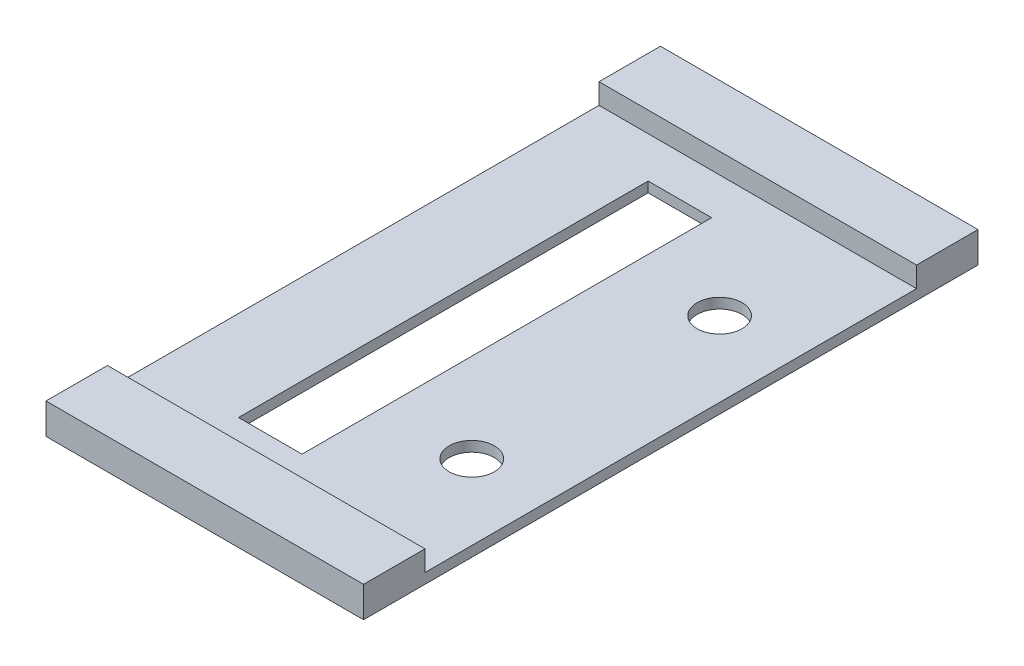
ISO-10303-21;
HEADER;
FILE_DESCRIPTION(('STEP AP214'),'2;1');
FILE_NAME('part.step','',(''),(''),'','','');
FILE_SCHEMA(('AUTOMOTIVE_DESIGN { 1 0 10303 214 1 1 1 1 }'));
ENDSEC;
DATA;
#1=APPLICATION_CONTEXT('core data for automotive mechanical design processes');
#2=APPLICATION_PROTOCOL_DEFINITION('international standard','automotive_design',2000,#1);
#3=PRODUCT_CONTEXT('',#1,'mechanical');
#4=PRODUCT('Part','Part','',(#3));
#5=PRODUCT_RELATED_PRODUCT_CATEGORY('part','',(#4));
#6=PRODUCT_DEFINITION_FORMATION('','',#4);
#7=PRODUCT_DEFINITION_CONTEXT('part definition',#1,'design');
#8=PRODUCT_DEFINITION('design','',#6,#7);
#9=PRODUCT_DEFINITION_SHAPE('','',#8);
#10=(LENGTH_UNIT() NAMED_UNIT(*) SI_UNIT(.MILLI.,.METRE.));
#11=(NAMED_UNIT(*) PLANE_ANGLE_UNIT() SI_UNIT($,.RADIAN.));
#12=(NAMED_UNIT(*) SI_UNIT($,.STERADIAN.) SOLID_ANGLE_UNIT());
#13=UNCERTAINTY_MEASURE_WITH_UNIT(LENGTH_MEASURE(1.E-05),#10,'distance_accuracy_value','');
#14=(GEOMETRIC_REPRESENTATION_CONTEXT(3) GLOBAL_UNCERTAINTY_ASSIGNED_CONTEXT((#13)) GLOBAL_UNIT_ASSIGNED_CONTEXT((#10,
#11,#12)) REPRESENTATION_CONTEXT('',''));
#15=CARTESIAN_POINT('',(0.,0.,0.));
#16=DIRECTION('',(0.,0.,1.));
#17=DIRECTION('',(1.,0.,0.));
#18=AXIS2_PLACEMENT_3D('',#15,#16,#17);
#19=CARTESIAN_POINT('',(39.3827,3.81,0.));
#20=DIRECTION('',(-1.,0.,0.));
#21=DIRECTION('',(0.,0.,1.));
#22=AXIS2_PLACEMENT_3D('',#19,#20,#21);
#23=PLANE('',#22);
#24=DIRECTION('',(0.,0.,-1.));
#25=VECTOR('',#24,1.);
#26=CARTESIAN_POINT('',(39.3827,0.,0.));
#27=LINE('',#26,#25);
#28=CARTESIAN_POINT('',(39.3827,0.,0.));
#29=VERTEX_POINT('',#28);
#30=CARTESIAN_POINT('',(39.3827,0.,-76.2));
#31=VERTEX_POINT('',#30);
#32=EDGE_CURVE('E211',#29,#31,#27,.T.);
#33=ORIENTED_EDGE('',*,*,#32,.T.);
#34=DIRECTION('',(0.,-1.,0.));
#35=VECTOR('',#34,1.);
#36=CARTESIAN_POINT('',(39.3827,3.81,-76.2));
#37=LINE('',#36,#35);
#38=CARTESIAN_POINT('',(39.3827,3.81,-76.2));
#39=VERTEX_POINT('',#38);
#40=EDGE_CURVE('E146',#39,#31,#37,.T.);
#41=ORIENTED_EDGE('',*,*,#40,.F.);
#42=DIRECTION('',(0.,0.,-1.));
#43=VECTOR('',#42,1.);
#44=CARTESIAN_POINT('',(39.3827,3.81,0.));
#45=LINE('',#44,#43);
#46=CARTESIAN_POINT('',(39.3827,3.81,-68.58));
#47=VERTEX_POINT('',#46);
#48=EDGE_CURVE('E149',#47,#39,#45,.T.);
#49=ORIENTED_EDGE('',*,*,#48,.F.);
#50=DIRECTION('',(0.,-1.,0.));
#51=VECTOR('',#50,1.);
#52=CARTESIAN_POINT('',(39.3827,3.81,-68.58));
#53=LINE('',#52,#51);
#54=CARTESIAN_POINT('',(39.3827,1.27,-68.58));
#55=VERTEX_POINT('',#54);
#56=EDGE_CURVE('E137',#47,#55,#53,.T.);
#57=ORIENTED_EDGE('',*,*,#56,.T.);
#58=DIRECTION('',(0.,0.,-1.));
#59=VECTOR('',#58,1.);
#60=CARTESIAN_POINT('',(39.3827,1.27,0.));
#61=LINE('',#60,#59);
#62=CARTESIAN_POINT('',(39.3827,1.27,-7.62));
#63=VERTEX_POINT('',#62);
#64=EDGE_CURVE('E188',#63,#55,#61,.T.);
#65=ORIENTED_EDGE('',*,*,#64,.F.);
#66=DIRECTION('',(0.,-1.,0.));
#67=VECTOR('',#66,1.);
#68=CARTESIAN_POINT('',(39.3827,3.81,-7.62));
#69=LINE('',#68,#67);
#70=CARTESIAN_POINT('',(39.3827,3.81,-7.62));
#71=VERTEX_POINT('',#70);
#72=EDGE_CURVE('E11',#71,#63,#69,.T.);
#73=ORIENTED_EDGE('',*,*,#72,.F.);
#74=DIRECTION('',(0.,0.,-1.));
#75=VECTOR('',#74,1.);
#76=CARTESIAN_POINT('',(39.3827,3.81,0.));
#77=LINE('',#76,#75);
#78=CARTESIAN_POINT('',(39.3827,3.81,0.));
#79=VERTEX_POINT('',#78);
#80=EDGE_CURVE('E208',#79,#71,#77,.T.);
#81=ORIENTED_EDGE('',*,*,#80,.F.);
#82=DIRECTION('',(0.,-1.,0.));
#83=VECTOR('',#82,1.);
#84=CARTESIAN_POINT('',(39.3827,3.81,0.));
#85=LINE('',#84,#83);
#86=EDGE_CURVE('E205',#79,#29,#85,.T.);
#87=ORIENTED_EDGE('',*,*,#86,.T.);
#88=EDGE_LOOP('',(#33,#41,#49,#57,#65,#73,#81,#87));
#89=FACE_BOUND('',#88,.T.);
#90=ADVANCED_FACE('F35',(#89),#23,.F.);
#91=CARTESIAN_POINT('',(0.,3.81,-7.62));
#92=DIRECTION('',(0.,0.,1.));
#93=DIRECTION('',(1.,0.,0.));
#94=AXIS2_PLACEMENT_3D('',#91,#92,#93);
#95=PLANE('',#94);
#96=ORIENTED_EDGE('',*,*,#72,.T.);
#97=DIRECTION('',(-1.,0.,0.));
#98=VECTOR('',#97,1.);
#99=CARTESIAN_POINT('',(0.,1.27,-7.62));
#100=LINE('',#99,#98);
#101=CARTESIAN_POINT('',(0.,1.27,-7.62));
#102=VERTEX_POINT('',#101);
#103=EDGE_CURVE('E181',#63,#102,#100,.T.);
#104=ORIENTED_EDGE('',*,*,#103,.T.);
#105=DIRECTION('',(0.,-1.,0.));
#106=VECTOR('',#105,1.);
#107=CARTESIAN_POINT('',(0.,3.81,-7.62));
#108=LINE('',#107,#106);
#109=CARTESIAN_POINT('',(0.,3.81,-7.62));
#110=VERTEX_POINT('',#109);
#111=EDGE_CURVE('E44',#110,#102,#108,.T.);
#112=ORIENTED_EDGE('',*,*,#111,.F.);
#113=DIRECTION('',(-1.,0.,0.));
#114=VECTOR('',#113,1.);
#115=CARTESIAN_POINT('',(0.,3.81,-7.62));
#116=LINE('',#115,#114);
#117=EDGE_CURVE('E83',#71,#110,#116,.T.);
#118=ORIENTED_EDGE('',*,*,#117,.F.);
#119=EDGE_LOOP('',(#96,#104,#112,#118));
#120=FACE_BOUND('',#119,.T.);
#121=ADVANCED_FACE('F285',(#120),#95,.F.);
#122=CARTESIAN_POINT('',(0.,3.81,0.));
#123=DIRECTION('',(-1.,0.,0.));
#124=DIRECTION('',(0.,0.,1.));
#125=AXIS2_PLACEMENT_3D('',#122,#123,#124);
#126=PLANE('',#125);
#127=DIRECTION('',(0.,0.,-1.));
#128=VECTOR('',#127,1.);
#129=CARTESIAN_POINT('',(0.,0.,0.));
#130=LINE('',#129,#128);
#131=CARTESIAN_POINT('',(0.,0.,0.));
#132=VERTEX_POINT('',#131);
#133=CARTESIAN_POINT('',(0.,0.,-76.2));
#134=VERTEX_POINT('',#133);
#135=EDGE_CURVE('E209',#132,#134,#130,.T.);
#136=ORIENTED_EDGE('',*,*,#135,.F.);
#137=DIRECTION('',(0.,-1.,0.));
#138=VECTOR('',#137,1.);
#139=CARTESIAN_POINT('',(0.,3.81,0.));
#140=LINE('',#139,#138);
#141=CARTESIAN_POINT('',(0.,3.81,0.));
#142=VERTEX_POINT('',#141);
#143=EDGE_CURVE('E203',#142,#132,#140,.T.);
#144=ORIENTED_EDGE('',*,*,#143,.F.);
#145=DIRECTION('',(0.,0.,-1.));
#146=VECTOR('',#145,1.);
#147=CARTESIAN_POINT('',(0.,3.81,0.));
#148=LINE('',#147,#146);
#149=EDGE_CURVE('E215',#142,#110,#148,.T.);
#150=ORIENTED_EDGE('',*,*,#149,.T.);
#151=ORIENTED_EDGE('',*,*,#111,.T.);
#152=DIRECTION('',(0.,0.,-1.));
#153=VECTOR('',#152,1.);
#154=CARTESIAN_POINT('',(0.,1.27,0.));
#155=LINE('',#154,#153);
#156=CARTESIAN_POINT('',(0.,1.27,-68.58));
#157=VERTEX_POINT('',#156);
#158=EDGE_CURVE('E52',#102,#157,#155,.T.);
#159=ORIENTED_EDGE('',*,*,#158,.T.);
#160=DIRECTION('',(0.,-1.,0.));
#161=VECTOR('',#160,1.);
#162=CARTESIAN_POINT('',(0.,3.81,-68.58));
#163=LINE('',#162,#161);
#164=CARTESIAN_POINT('',(0.,3.81,-68.58));
#165=VERTEX_POINT('',#164);
#166=EDGE_CURVE('E165',#165,#157,#163,.T.);
#167=ORIENTED_EDGE('',*,*,#166,.F.);
#168=DIRECTION('',(0.,0.,-1.));
#169=VECTOR('',#168,1.);
#170=CARTESIAN_POINT('',(0.,3.81,0.));
#171=LINE('',#170,#169);
#172=CARTESIAN_POINT('',(0.,3.81,-76.2));
#173=VERTEX_POINT('',#172);
#174=EDGE_CURVE('E158',#165,#173,#171,.T.);
#175=ORIENTED_EDGE('',*,*,#174,.T.);
#176=DIRECTION('',(0.,-1.,0.));
#177=VECTOR('',#176,1.);
#178=CARTESIAN_POINT('',(0.,3.81,-76.2));
#179=LINE('',#178,#177);
#180=EDGE_CURVE('E169',#173,#134,#179,.T.);
#181=ORIENTED_EDGE('',*,*,#180,.T.);
#182=EDGE_LOOP('',(#136,#144,#150,#151,#159,#167,#175,#181));
#183=FACE_BOUND('',#182,.T.);
#184=ADVANCED_FACE('F289',(#183),#126,.T.);
#185=CARTESIAN_POINT('',(0.,3.81,0.));
#186=DIRECTION('',(0.,0.,-1.));
#187=DIRECTION('',(-1.,0.,0.));
#188=AXIS2_PLACEMENT_3D('',#185,#186,#187);
#189=PLANE('',#188);
#190=DIRECTION('',(1.,0.,0.));
#191=VECTOR('',#190,1.);
#192=CARTESIAN_POINT('',(0.,0.,0.));
#193=LINE('',#192,#191);
#194=EDGE_CURVE('E76',#132,#29,#193,.T.);
#195=ORIENTED_EDGE('',*,*,#194,.T.);
#196=ORIENTED_EDGE('',*,*,#86,.F.);
#197=DIRECTION('',(1.,0.,0.));
#198=VECTOR('',#197,1.);
#199=CARTESIAN_POINT('',(0.,3.81,0.));
#200=LINE('',#199,#198);
#201=EDGE_CURVE('E61',#142,#79,#200,.T.);
#202=ORIENTED_EDGE('',*,*,#201,.F.);
#203=ORIENTED_EDGE('',*,*,#143,.T.);
#204=EDGE_LOOP('',(#195,#196,#202,#203));
#205=FACE_BOUND('',#204,.T.);
#206=ADVANCED_FACE('F279',(#205),#189,.F.);
#207=CARTESIAN_POINT('',(0.,3.81,0.));
#208=DIRECTION('',(0.,1.,0.));
#209=DIRECTION('',(0.,0.,1.));
#210=AXIS2_PLACEMENT_3D('',#207,#208,#209);
#211=PLANE('',#210);
#212=ORIENTED_EDGE('',*,*,#80,.T.);
#213=ORIENTED_EDGE('',*,*,#117,.T.);
#214=ORIENTED_EDGE('',*,*,#149,.F.);
#215=ORIENTED_EDGE('',*,*,#201,.T.);
#216=EDGE_LOOP('',(#212,#213,#214,#215));
#217=FACE_BOUND('',#216,.T.);
#218=ADVANCED_FACE('F271',(#217),#211,.T.);
#219=CARTESIAN_POINT('',(0.,0.,0.));
#220=DIRECTION('',(0.,1.,0.));
#221=DIRECTION('',(0.,0.,1.));
#222=AXIS2_PLACEMENT_3D('',#219,#220,#221);
#223=PLANE('',#222);
#224=ORIENTED_EDGE('',*,*,#32,.F.);
#225=ORIENTED_EDGE('',*,*,#194,.F.);
#226=ORIENTED_EDGE('',*,*,#135,.T.);
#227=DIRECTION('',(1.,0.,0.));
#228=VECTOR('',#227,1.);
#229=CARTESIAN_POINT('',(0.,0.,-76.2));
#230=LINE('',#229,#228);
#231=EDGE_CURVE('E159',#134,#31,#230,.T.);
#232=ORIENTED_EDGE('',*,*,#231,.T.);
#233=EDGE_LOOP('',(#224,#225,#226,#232));
#234=FACE_BOUND('',#233,.T.);
#235=CARTESIAN_POINT('',(30.0679322618683,0.,-22.733));
#236=DIRECTION('',(0.,1.,0.));
#237=DIRECTION('',(0.,0.,1.));
#238=AXIS2_PLACEMENT_3D('',#235,#236,#237);
#239=CIRCLE('',#238,2.79399999999999);
#240=CARTESIAN_POINT('',(30.0679322618683,0.,-19.939));
#241=VERTEX_POINT('',#240);
#242=EDGE_CURVE('E145',#241,#241,#239,.T.);
#243=ORIENTED_EDGE('',*,*,#242,.T.);
#244=EDGE_LOOP('',(#243));
#245=FACE_BOUND('',#244,.T.);
#246=CARTESIAN_POINT('',(30.0679322618683,0.,-53.467));
#247=DIRECTION('',(0.,1.,0.));
#248=DIRECTION('',(0.,0.,1.));
#249=AXIS2_PLACEMENT_3D('',#246,#247,#248);
#250=CIRCLE('',#249,2.794);
#251=CARTESIAN_POINT('',(30.0679322618683,0.,-50.673));
#252=VERTEX_POINT('',#251);
#253=EDGE_CURVE('E239',#252,#252,#250,.T.);
#254=ORIENTED_EDGE('',*,*,#253,.T.);
#255=EDGE_LOOP('',(#254));
#256=FACE_BOUND('',#255,.T.);
#257=DIRECTION('',(0.,0.,-1.));
#258=VECTOR('',#257,1.);
#259=CARTESIAN_POINT('',(19.05,0.,0.));
#260=LINE('',#259,#258);
#261=CARTESIAN_POINT('',(19.05,0.,-12.7));
#262=VERTEX_POINT('',#261);
#263=CARTESIAN_POINT('',(19.05,0.,-63.5));
#264=VERTEX_POINT('',#263);
#265=EDGE_CURVE('E236',#262,#264,#260,.T.);
#266=ORIENTED_EDGE('',*,*,#265,.T.);
#267=DIRECTION('',(-1.,0.,0.));
#268=VECTOR('',#267,1.);
#269=CARTESIAN_POINT('',(0.,0.,-63.5));
#270=LINE('',#269,#268);
#271=CARTESIAN_POINT('',(11.176,0.,-63.5));
#272=VERTEX_POINT('',#271);
#273=EDGE_CURVE('E178',#264,#272,#270,.T.);
#274=ORIENTED_EDGE('',*,*,#273,.T.);
#275=DIRECTION('',(0.,0.,1.));
#276=VECTOR('',#275,1.);
#277=CARTESIAN_POINT('',(11.176,0.,0.));
#278=LINE('',#277,#276);
#279=CARTESIAN_POINT('',(11.176,0.,-12.7));
#280=VERTEX_POINT('',#279);
#281=EDGE_CURVE('E230',#272,#280,#278,.T.);
#282=ORIENTED_EDGE('',*,*,#281,.T.);
#283=DIRECTION('',(1.,0.,0.));
#284=VECTOR('',#283,1.);
#285=CARTESIAN_POINT('',(0.,0.,-12.7));
#286=LINE('',#285,#284);
#287=EDGE_CURVE('E233',#280,#262,#286,.T.);
#288=ORIENTED_EDGE('',*,*,#287,.T.);
#289=EDGE_LOOP('',(#266,#274,#282,#288));
#290=FACE_BOUND('',#289,.T.);
#291=ADVANCED_FACE('F269',(#234,#245,#256,#290),#223,.F.);
#292=CARTESIAN_POINT('',(19.05,1.27,0.));
#293=DIRECTION('',(-1.,0.,0.));
#294=DIRECTION('',(0.,0.,1.));
#295=AXIS2_PLACEMENT_3D('',#292,#293,#294);
#296=PLANE('',#295);
#297=ORIENTED_EDGE('',*,*,#265,.F.);
#298=DIRECTION('',(0.,-1.,0.));
#299=VECTOR('',#298,1.);
#300=CARTESIAN_POINT('',(19.05,1.27,-12.7));
#301=LINE('',#300,#299);
#302=CARTESIAN_POINT('',(19.05,1.27,-12.7));
#303=VERTEX_POINT('',#302);
#304=EDGE_CURVE('E213',#303,#262,#301,.T.);
#305=ORIENTED_EDGE('',*,*,#304,.F.);
#306=DIRECTION('',(0.,0.,-1.));
#307=VECTOR('',#306,1.);
#308=CARTESIAN_POINT('',(19.05,1.27,0.));
#309=LINE('',#308,#307);
#310=CARTESIAN_POINT('',(19.05,1.27,-63.5));
#311=VERTEX_POINT('',#310);
#312=EDGE_CURVE('E192',#303,#311,#309,.T.);
#313=ORIENTED_EDGE('',*,*,#312,.T.);
#314=DIRECTION('',(0.,-1.,0.));
#315=VECTOR('',#314,1.);
#316=CARTESIAN_POINT('',(19.05,1.27,-63.5));
#317=LINE('',#316,#315);
#318=EDGE_CURVE('E225',#311,#264,#317,.T.);
#319=ORIENTED_EDGE('',*,*,#318,.T.);
#320=EDGE_LOOP('',(#297,#305,#313,#319));
#321=FACE_BOUND('',#320,.T.);
#322=ADVANCED_FACE('F267',(#321),#296,.T.);
#323=CARTESIAN_POINT('',(0.,1.27,-12.7));
#324=DIRECTION('',(0.,0.,-1.));
#325=DIRECTION('',(-1.,0.,0.));
#326=AXIS2_PLACEMENT_3D('',#323,#324,#325);
#327=PLANE('',#326);
#328=ORIENTED_EDGE('',*,*,#287,.F.);
#329=DIRECTION('',(0.,-1.,0.));
#330=VECTOR('',#329,1.);
#331=CARTESIAN_POINT('',(11.176,1.27,-12.7));
#332=LINE('',#331,#330);
#333=CARTESIAN_POINT('',(11.176,1.27,-12.7));
#334=VERTEX_POINT('',#333);
#335=EDGE_CURVE('E221',#334,#280,#332,.T.);
#336=ORIENTED_EDGE('',*,*,#335,.F.);
#337=DIRECTION('',(1.,0.,0.));
#338=VECTOR('',#337,1.);
#339=CARTESIAN_POINT('',(0.,1.27,-12.7));
#340=LINE('',#339,#338);
#341=EDGE_CURVE('E196',#334,#303,#340,.T.);
#342=ORIENTED_EDGE('',*,*,#341,.T.);
#343=ORIENTED_EDGE('',*,*,#304,.T.);
#344=EDGE_LOOP('',(#328,#336,#342,#343));
#345=FACE_BOUND('',#344,.T.);
#346=ADVANCED_FACE('F253',(#345),#327,.T.);
#347=CARTESIAN_POINT('',(11.176,1.27,0.));
#348=DIRECTION('',(1.,0.,0.));
#349=DIRECTION('',(0.,0.,-1.));
#350=AXIS2_PLACEMENT_3D('',#347,#348,#349);
#351=PLANE('',#350);
#352=ORIENTED_EDGE('',*,*,#281,.F.);
#353=DIRECTION('',(0.,-1.,0.));
#354=VECTOR('',#353,1.);
#355=CARTESIAN_POINT('',(11.176,1.27,-63.5));
#356=LINE('',#355,#354);
#357=CARTESIAN_POINT('',(11.176,1.27,-63.5));
#358=VERTEX_POINT('',#357);
#359=EDGE_CURVE('E223',#358,#272,#356,.T.);
#360=ORIENTED_EDGE('',*,*,#359,.F.);
#361=DIRECTION('',(0.,0.,1.));
#362=VECTOR('',#361,1.);
#363=CARTESIAN_POINT('',(11.176,1.27,0.));
#364=LINE('',#363,#362);
#365=EDGE_CURVE('E246',#358,#334,#364,.T.);
#366=ORIENTED_EDGE('',*,*,#365,.T.);
#367=ORIENTED_EDGE('',*,*,#335,.T.);
#368=EDGE_LOOP('',(#352,#360,#366,#367));
#369=FACE_BOUND('',#368,.T.);
#370=ADVANCED_FACE('F262',(#369),#351,.T.);
#371=CARTESIAN_POINT('',(30.0679322618683,1.27,-53.467));
#372=DIRECTION('',(0.,-1.,0.));
#373=DIRECTION('',(0.,0.,-1.));
#374=AXIS2_PLACEMENT_3D('',#371,#372,#373);
#375=CYLINDRICAL_SURFACE('',#374,2.794);
#376=CARTESIAN_POINT('',(30.0679322618683,1.27,-53.467));
#377=DIRECTION('',(0.,1.,0.));
#378=DIRECTION('',(0.,0.,1.));
#379=AXIS2_PLACEMENT_3D('',#376,#377,#378);
#380=CIRCLE('',#379,2.794);
#381=CARTESIAN_POINT('',(30.0679322618683,1.27,-50.673));
#382=VERTEX_POINT('',#381);
#383=EDGE_CURVE('E177',#382,#382,#380,.T.);
#384=ORIENTED_EDGE('',*,*,#383,.T.);
#385=EDGE_LOOP('',(#384));
#386=FACE_BOUND('',#385,.T.);
#387=ORIENTED_EDGE('',*,*,#253,.F.);
#388=EDGE_LOOP('',(#387));
#389=FACE_BOUND('',#388,.T.);
#390=ADVANCED_FACE('F349',(#386,#389),#375,.F.);
#391=CARTESIAN_POINT('',(30.0679322618683,1.27,-22.733));
#392=DIRECTION('',(0.,-1.,0.));
#393=DIRECTION('',(0.,0.,-1.));
#394=AXIS2_PLACEMENT_3D('',#391,#392,#393);
#395=CYLINDRICAL_SURFACE('',#394,2.79399999999999);
#396=CARTESIAN_POINT('',(30.0679322618683,1.27,-22.733));
#397=DIRECTION('',(0.,1.,0.));
#398=DIRECTION('',(0.,0.,1.));
#399=AXIS2_PLACEMENT_3D('',#396,#397,#398);
#400=CIRCLE('',#399,2.79399999999999);
#401=CARTESIAN_POINT('',(30.0679322618683,1.27,-19.939));
#402=VERTEX_POINT('',#401);
#403=EDGE_CURVE('E174',#402,#402,#400,.T.);
#404=ORIENTED_EDGE('',*,*,#403,.T.);
#405=EDGE_LOOP('',(#404));
#406=FACE_BOUND('',#405,.T.);
#407=ORIENTED_EDGE('',*,*,#242,.F.);
#408=EDGE_LOOP('',(#407));
#409=FACE_BOUND('',#408,.T.);
#410=ADVANCED_FACE('F358',(#406,#409),#395,.F.);
#411=CARTESIAN_POINT('',(0.,1.27,-63.5));
#412=DIRECTION('',(0.,0.,1.));
#413=DIRECTION('',(1.,0.,0.));
#414=AXIS2_PLACEMENT_3D('',#411,#412,#413);
#415=PLANE('',#414);
#416=ORIENTED_EDGE('',*,*,#273,.F.);
#417=ORIENTED_EDGE('',*,*,#318,.F.);
#418=DIRECTION('',(-1.,0.,0.));
#419=VECTOR('',#418,1.);
#420=CARTESIAN_POINT('',(0.,1.27,-63.5));
#421=LINE('',#420,#419);
#422=EDGE_CURVE('E227',#311,#358,#421,.T.);
#423=ORIENTED_EDGE('',*,*,#422,.T.);
#424=ORIENTED_EDGE('',*,*,#359,.T.);
#425=EDGE_LOOP('',(#416,#417,#423,#424));
#426=FACE_BOUND('',#425,.T.);
#427=ADVANCED_FACE('F265',(#426),#415,.T.);
#428=CARTESIAN_POINT('',(0.,1.27,0.));
#429=DIRECTION('',(0.,1.,0.));
#430=DIRECTION('',(0.,0.,1.));
#431=AXIS2_PLACEMENT_3D('',#428,#429,#430);
#432=PLANE('',#431);
#433=ORIENTED_EDGE('',*,*,#403,.F.);
#434=EDGE_LOOP('',(#433));
#435=FACE_BOUND('',#434,.T.);
#436=ORIENTED_EDGE('',*,*,#383,.F.);
#437=EDGE_LOOP('',(#436));
#438=FACE_BOUND('',#437,.T.);
#439=ORIENTED_EDGE('',*,*,#103,.F.);
#440=ORIENTED_EDGE('',*,*,#64,.T.);
#441=DIRECTION('',(-1.,0.,0.));
#442=VECTOR('',#441,1.);
#443=CARTESIAN_POINT('',(0.,1.27,-68.58));
#444=LINE('',#443,#442);
#445=EDGE_CURVE('E38',#55,#157,#444,.T.);
#446=ORIENTED_EDGE('',*,*,#445,.T.);
#447=ORIENTED_EDGE('',*,*,#158,.F.);
#448=EDGE_LOOP('',(#439,#440,#446,#447));
#449=FACE_BOUND('',#448,.T.);
#450=ORIENTED_EDGE('',*,*,#312,.F.);
#451=ORIENTED_EDGE('',*,*,#341,.F.);
#452=ORIENTED_EDGE('',*,*,#365,.F.);
#453=ORIENTED_EDGE('',*,*,#422,.F.);
#454=EDGE_LOOP('',(#450,#451,#452,#453));
#455=FACE_BOUND('',#454,.T.);
#456=ADVANCED_FACE('F258',(#435,#438,#449,#455),#432,.T.);
#457=CARTESIAN_POINT('',(0.,3.81,-68.58));
#458=DIRECTION('',(0.,0.,1.));
#459=DIRECTION('',(1.,0.,0.));
#460=AXIS2_PLACEMENT_3D('',#457,#458,#459);
#461=PLANE('',#460);
#462=ORIENTED_EDGE('',*,*,#445,.F.);
#463=ORIENTED_EDGE('',*,*,#56,.F.);
#464=DIRECTION('',(-1.,0.,0.));
#465=VECTOR('',#464,1.);
#466=CARTESIAN_POINT('',(0.,3.81,-68.58));
#467=LINE('',#466,#465);
#468=EDGE_CURVE('E141',#47,#165,#467,.T.);
#469=ORIENTED_EDGE('',*,*,#468,.T.);
#470=ORIENTED_EDGE('',*,*,#166,.T.);
#471=EDGE_LOOP('',(#462,#463,#469,#470));
#472=FACE_BOUND('',#471,.T.);
#473=ADVANCED_FACE('F139',(#472),#461,.T.);
#474=CARTESIAN_POINT('',(0.,3.81,-76.2));
#475=DIRECTION('',(0.,0.,-1.));
#476=DIRECTION('',(-1.,0.,0.));
#477=AXIS2_PLACEMENT_3D('',#474,#475,#476);
#478=PLANE('',#477);
#479=ORIENTED_EDGE('',*,*,#231,.F.);
#480=ORIENTED_EDGE('',*,*,#180,.F.);
#481=DIRECTION('',(1.,0.,0.));
#482=VECTOR('',#481,1.);
#483=CARTESIAN_POINT('',(0.,3.81,-76.2));
#484=LINE('',#483,#482);
#485=EDGE_CURVE('E154',#173,#39,#484,.T.);
#486=ORIENTED_EDGE('',*,*,#485,.T.);
#487=ORIENTED_EDGE('',*,*,#40,.T.);
#488=EDGE_LOOP('',(#479,#480,#486,#487));
#489=FACE_BOUND('',#488,.T.);
#490=ADVANCED_FACE('F394',(#489),#478,.T.);
#491=CARTESIAN_POINT('',(0.,3.81,0.));
#492=DIRECTION('',(0.,1.,0.));
#493=DIRECTION('',(0.,0.,1.));
#494=AXIS2_PLACEMENT_3D('',#491,#492,#493);
#495=PLANE('',#494);
#496=ORIENTED_EDGE('',*,*,#468,.F.);
#497=ORIENTED_EDGE('',*,*,#48,.T.);
#498=ORIENTED_EDGE('',*,*,#485,.F.);
#499=ORIENTED_EDGE('',*,*,#174,.F.);
#500=EDGE_LOOP('',(#496,#497,#498,#499));
#501=FACE_BOUND('',#500,.T.);
#502=ADVANCED_FACE('F156',(#501),#495,.T.);
#503=CLOSED_SHELL('',(#90,#121,#184,#206,#218,#291,#322,#346,#370,#390,#410,#427,#456,#473,#490,#502));
#504=MANIFOLD_SOLID_BREP('B2',#503);
#505=ADVANCED_BREP_SHAPE_REPRESENTATION('',(#18,#504),#14);
#506=SHAPE_DEFINITION_REPRESENTATION(#9,#505);
ENDSEC;
END-ISO-10303-21;
